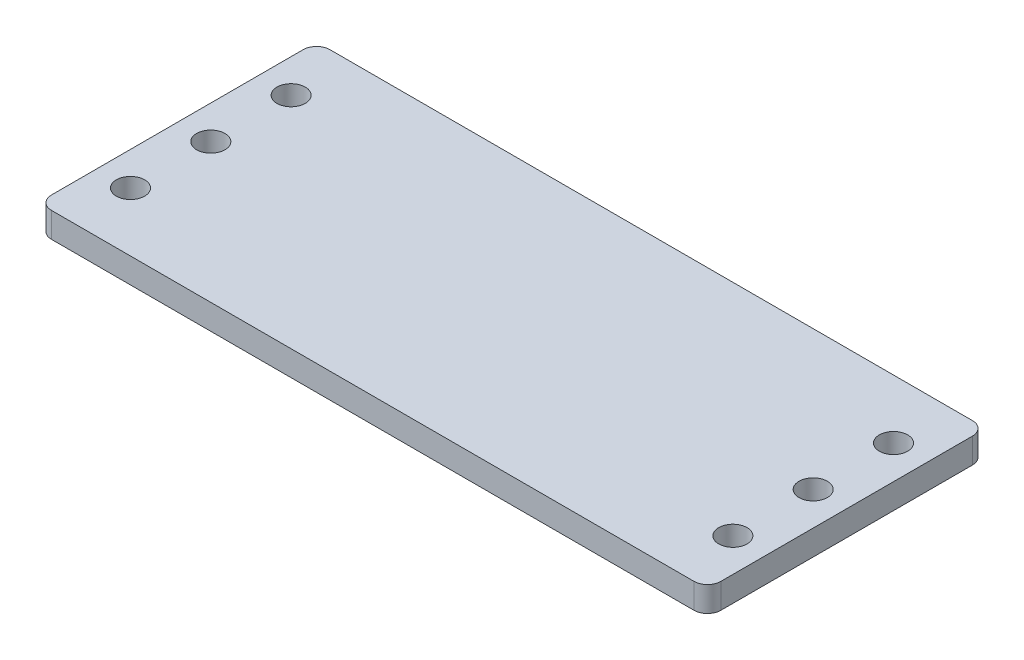
ISO-10303-21;
HEADER;
FILE_DESCRIPTION(('STEP AP214'),'2;1');
FILE_NAME('part.step','',(''),(''),'','','');
FILE_SCHEMA(('AUTOMOTIVE_DESIGN { 1 0 10303 214 1 1 1 1 }'));
ENDSEC;
DATA;
#1=APPLICATION_CONTEXT('core data for automotive mechanical design processes');
#2=APPLICATION_PROTOCOL_DEFINITION('international standard','automotive_design',2000,#1);
#3=PRODUCT_CONTEXT('',#1,'mechanical');
#4=PRODUCT('Part','Part','',(#3));
#5=PRODUCT_RELATED_PRODUCT_CATEGORY('part','',(#4));
#6=PRODUCT_DEFINITION_FORMATION('','',#4);
#7=PRODUCT_DEFINITION_CONTEXT('part definition',#1,'design');
#8=PRODUCT_DEFINITION('design','',#6,#7);
#9=PRODUCT_DEFINITION_SHAPE('','',#8);
#10=(LENGTH_UNIT() NAMED_UNIT(*) SI_UNIT(.MILLI.,.METRE.));
#11=(NAMED_UNIT(*) PLANE_ANGLE_UNIT() SI_UNIT($,.RADIAN.));
#12=(NAMED_UNIT(*) SI_UNIT($,.STERADIAN.) SOLID_ANGLE_UNIT());
#13=UNCERTAINTY_MEASURE_WITH_UNIT(LENGTH_MEASURE(1.E-05),#10,'distance_accuracy_value','');
#14=(GEOMETRIC_REPRESENTATION_CONTEXT(3) GLOBAL_UNCERTAINTY_ASSIGNED_CONTEXT((#13)) GLOBAL_UNIT_ASSIGNED_CONTEXT((#10,
#11,#12)) REPRESENTATION_CONTEXT('',''));
#15=CARTESIAN_POINT('',(0.,0.,0.));
#16=DIRECTION('',(0.,0.,1.));
#17=DIRECTION('',(1.,0.,0.));
#18=AXIS2_PLACEMENT_3D('',#15,#16,#17);
#19=CARTESIAN_POINT('',(63.5,4.7625,-26.416));
#20=DIRECTION('',(-1.,0.,0.));
#21=DIRECTION('',(0.,0.,1.));
#22=AXIS2_PLACEMENT_3D('',#19,#20,#21);
#23=PLANE('',#22);
#24=DIRECTION('',(0.,0.,-1.));
#25=VECTOR('',#24,1.);
#26=CARTESIAN_POINT('',(63.5,4.7625,-26.416));
#27=LINE('',#26,#25);
#28=CARTESIAN_POINT('',(63.5,4.7625,23.876));
#29=VERTEX_POINT('',#28);
#30=CARTESIAN_POINT('',(63.5,4.7625,-23.876));
#31=VERTEX_POINT('',#30);
#32=EDGE_CURVE('E119',#29,#31,#27,.T.);
#33=ORIENTED_EDGE('',*,*,#32,.F.);
#34=DIRECTION('',(0.,-1.,0.));
#35=VECTOR('',#34,1.);
#36=CARTESIAN_POINT('',(63.5,4.7625,23.876));
#37=LINE('',#36,#35);
#38=CARTESIAN_POINT('',(63.5,0.,23.876));
#39=VERTEX_POINT('',#38);
#40=EDGE_CURVE('E104',#29,#39,#37,.T.);
#41=ORIENTED_EDGE('',*,*,#40,.T.);
#42=DIRECTION('',(0.,0.,-1.));
#43=VECTOR('',#42,1.);
#44=CARTESIAN_POINT('',(63.5,0.,-26.416));
#45=LINE('',#44,#43);
#46=CARTESIAN_POINT('',(63.5,0.,-23.876));
#47=VERTEX_POINT('',#46);
#48=EDGE_CURVE('E116',#39,#47,#45,.T.);
#49=ORIENTED_EDGE('',*,*,#48,.T.);
#50=DIRECTION('',(0.,-1.,0.));
#51=VECTOR('',#50,1.);
#52=CARTESIAN_POINT('',(63.5,4.7625,-23.876));
#53=LINE('',#52,#51);
#54=EDGE_CURVE('E121',#47,#31,#53,.F.);
#55=ORIENTED_EDGE('',*,*,#54,.T.);
#56=EDGE_LOOP('',(#33,#41,#49,#55));
#57=FACE_BOUND('',#56,.T.);
#58=ADVANCED_FACE('F34',(#57),#23,.F.);
#59=CARTESIAN_POINT('',(-63.5,4.7625,-26.416));
#60=DIRECTION('',(0.,0.,1.));
#61=DIRECTION('',(1.,0.,0.));
#62=AXIS2_PLACEMENT_3D('',#59,#60,#61);
#63=PLANE('',#62);
#64=DIRECTION('',(-1.,0.,0.));
#65=VECTOR('',#64,1.);
#66=CARTESIAN_POINT('',(-63.5,4.7625,-26.416));
#67=LINE('',#66,#65);
#68=CARTESIAN_POINT('',(60.96,4.7625,-26.416));
#69=VERTEX_POINT('',#68);
#70=CARTESIAN_POINT('',(-60.96,4.7625,-26.416));
#71=VERTEX_POINT('',#70);
#72=EDGE_CURVE('E165',#69,#71,#67,.T.);
#73=ORIENTED_EDGE('',*,*,#72,.F.);
#74=DIRECTION('',(0.,-1.,0.));
#75=VECTOR('',#74,1.);
#76=CARTESIAN_POINT('',(60.96,4.7625,-26.416));
#77=LINE('',#76,#75);
#78=CARTESIAN_POINT('',(60.96,0.,-26.416));
#79=VERTEX_POINT('',#78);
#80=EDGE_CURVE('E158',#69,#79,#77,.T.);
#81=ORIENTED_EDGE('',*,*,#80,.T.);
#82=DIRECTION('',(-1.,0.,0.));
#83=VECTOR('',#82,1.);
#84=CARTESIAN_POINT('',(-63.5,0.,-26.416));
#85=LINE('',#84,#83);
#86=CARTESIAN_POINT('',(-60.96,0.,-26.416));
#87=VERTEX_POINT('',#86);
#88=EDGE_CURVE('E125',#79,#87,#85,.T.);
#89=ORIENTED_EDGE('',*,*,#88,.T.);
#90=DIRECTION('',(0.,-1.,0.));
#91=VECTOR('',#90,1.);
#92=CARTESIAN_POINT('',(-60.96,4.7625,-26.416));
#93=LINE('',#92,#91);
#94=EDGE_CURVE('E156',#87,#71,#93,.F.);
#95=ORIENTED_EDGE('',*,*,#94,.T.);
#96=EDGE_LOOP('',(#73,#81,#89,#95));
#97=FACE_BOUND('',#96,.T.);
#98=ADVANCED_FACE('F163',(#97),#63,.F.);
#99=CARTESIAN_POINT('',(-63.5,4.7625,-26.416));
#100=DIRECTION('',(1.,0.,0.));
#101=DIRECTION('',(0.,0.,-1.));
#102=AXIS2_PLACEMENT_3D('',#99,#100,#101);
#103=PLANE('',#102);
#104=DIRECTION('',(0.,0.,1.));
#105=VECTOR('',#104,1.);
#106=CARTESIAN_POINT('',(-63.5,4.7625,-26.416));
#107=LINE('',#106,#105);
#108=CARTESIAN_POINT('',(-63.5,4.7625,-23.876));
#109=VERTEX_POINT('',#108);
#110=CARTESIAN_POINT('',(-63.5,4.7625,23.876));
#111=VERTEX_POINT('',#110);
#112=EDGE_CURVE('E173',#109,#111,#107,.T.);
#113=ORIENTED_EDGE('',*,*,#112,.F.);
#114=DIRECTION('',(0.,-1.,0.));
#115=VECTOR('',#114,1.);
#116=CARTESIAN_POINT('',(-63.5,4.7625,-23.876));
#117=LINE('',#116,#115);
#118=CARTESIAN_POINT('',(-63.5,0.,-23.876));
#119=VERTEX_POINT('',#118);
#120=EDGE_CURVE('E12',#109,#119,#117,.T.);
#121=ORIENTED_EDGE('',*,*,#120,.T.);
#122=DIRECTION('',(0.,0.,1.));
#123=VECTOR('',#122,1.);
#124=CARTESIAN_POINT('',(-63.5,0.,-26.416));
#125=LINE('',#124,#123);
#126=CARTESIAN_POINT('',(-63.5,0.,23.876));
#127=VERTEX_POINT('',#126);
#128=EDGE_CURVE('E129',#119,#127,#125,.T.);
#129=ORIENTED_EDGE('',*,*,#128,.T.);
#130=DIRECTION('',(0.,-1.,0.));
#131=VECTOR('',#130,1.);
#132=CARTESIAN_POINT('',(-63.5,4.7625,23.876));
#133=LINE('',#132,#131);
#134=EDGE_CURVE('E42',#127,#111,#133,.F.);
#135=ORIENTED_EDGE('',*,*,#134,.T.);
#136=EDGE_LOOP('',(#113,#121,#129,#135));
#137=FACE_BOUND('',#136,.T.);
#138=ADVANCED_FACE('F172',(#137),#103,.F.);
#139=CARTESIAN_POINT('',(-63.5,4.7625,26.416));
#140=DIRECTION('',(0.,0.,-1.));
#141=DIRECTION('',(-1.,0.,0.));
#142=AXIS2_PLACEMENT_3D('',#139,#140,#141);
#143=PLANE('',#142);
#144=DIRECTION('',(1.,0.,0.));
#145=VECTOR('',#144,1.);
#146=CARTESIAN_POINT('',(-63.5,0.,26.416));
#147=LINE('',#146,#145);
#148=CARTESIAN_POINT('',(-60.96,0.,26.416));
#149=VERTEX_POINT('',#148);
#150=CARTESIAN_POINT('',(60.96,0.,26.416));
#151=VERTEX_POINT('',#150);
#152=EDGE_CURVE('E139',#149,#151,#147,.T.);
#153=ORIENTED_EDGE('',*,*,#152,.T.);
#154=DIRECTION('',(0.,-1.,0.));
#155=VECTOR('',#154,1.);
#156=CARTESIAN_POINT('',(60.96,4.7625,26.416));
#157=LINE('',#156,#155);
#158=CARTESIAN_POINT('',(60.96,4.7625,26.416));
#159=VERTEX_POINT('',#158);
#160=EDGE_CURVE('E105',#151,#159,#157,.F.);
#161=ORIENTED_EDGE('',*,*,#160,.T.);
#162=DIRECTION('',(1.,0.,0.));
#163=VECTOR('',#162,1.);
#164=CARTESIAN_POINT('',(-63.5,4.7625,26.416));
#165=LINE('',#164,#163);
#166=CARTESIAN_POINT('',(-60.96,4.7625,26.416));
#167=VERTEX_POINT('',#166);
#168=EDGE_CURVE('E135',#167,#159,#165,.T.);
#169=ORIENTED_EDGE('',*,*,#168,.F.);
#170=DIRECTION('',(0.,-1.,0.));
#171=VECTOR('',#170,1.);
#172=CARTESIAN_POINT('',(-60.96,4.7625,26.416));
#173=LINE('',#172,#171);
#174=EDGE_CURVE('E110',#167,#149,#173,.T.);
#175=ORIENTED_EDGE('',*,*,#174,.T.);
#176=EDGE_LOOP('',(#153,#161,#169,#175));
#177=FACE_BOUND('',#176,.T.);
#178=ADVANCED_FACE('F218',(#177),#143,.F.);
#179=CARTESIAN_POINT('',(0.,4.7625,0.));
#180=DIRECTION('',(0.,1.,0.));
#181=DIRECTION('',(0.,0.,1.));
#182=AXIS2_PLACEMENT_3D('',#179,#180,#181);
#183=PLANE('',#182);
#184=CARTESIAN_POINT('',(-57.1499999999987,4.7625,0.));
#185=DIRECTION('',(0.,1.,0.));
#186=DIRECTION('',(0.,0.,-1.));
#187=AXIS2_PLACEMENT_3D('',#184,#185,#186);
#188=CIRCLE('',#187,2.69);
#189=CARTESIAN_POINT('',(-57.1499999999987,4.7625,-2.69));
#190=VERTEX_POINT('',#189);
#191=EDGE_CURVE('E197',#190,#190,#188,.T.);
#192=ORIENTED_EDGE('',*,*,#191,.F.);
#193=EDGE_LOOP('',(#192));
#194=FACE_BOUND('',#193,.T.);
#195=CARTESIAN_POINT('',(-57.1499999999987,4.7625,15.24));
#196=DIRECTION('',(0.,1.,0.));
#197=DIRECTION('',(0.,0.,-1.));
#198=AXIS2_PLACEMENT_3D('',#195,#196,#197);
#199=CIRCLE('',#198,2.69);
#200=CARTESIAN_POINT('',(-57.1499999999987,4.7625,12.55));
#201=VERTEX_POINT('',#200);
#202=EDGE_CURVE('E203',#201,#201,#199,.T.);
#203=ORIENTED_EDGE('',*,*,#202,.F.);
#204=EDGE_LOOP('',(#203));
#205=FACE_BOUND('',#204,.T.);
#206=CARTESIAN_POINT('',(-57.1499999999987,4.7625,-15.24));
#207=DIRECTION('',(0.,1.,0.));
#208=DIRECTION('',(0.,0.,-1.));
#209=AXIS2_PLACEMENT_3D('',#206,#207,#208);
#210=CIRCLE('',#209,2.69);
#211=CARTESIAN_POINT('',(-57.1499999999987,4.7625,-17.93));
#212=VERTEX_POINT('',#211);
#213=EDGE_CURVE('E186',#212,#212,#210,.T.);
#214=ORIENTED_EDGE('',*,*,#213,.F.);
#215=EDGE_LOOP('',(#214));
#216=FACE_BOUND('',#215,.T.);
#217=CARTESIAN_POINT('',(57.1499999999987,4.7625,0.));
#218=DIRECTION('',(0.,-1.,0.));
#219=DIRECTION('',(0.,0.,-1.));
#220=AXIS2_PLACEMENT_3D('',#217,#218,#219);
#221=CIRCLE('',#220,2.69);
#222=CARTESIAN_POINT('',(57.1499999999987,4.7625,-2.69));
#223=VERTEX_POINT('',#222);
#224=EDGE_CURVE('E180',#223,#223,#221,.T.);
#225=ORIENTED_EDGE('',*,*,#224,.T.);
#226=EDGE_LOOP('',(#225));
#227=FACE_BOUND('',#226,.T.);
#228=CARTESIAN_POINT('',(57.1499999999987,4.7625,15.24));
#229=DIRECTION('',(0.,-1.,0.));
#230=DIRECTION('',(0.,0.,-1.));
#231=AXIS2_PLACEMENT_3D('',#228,#229,#230);
#232=CIRCLE('',#231,2.69);
#233=CARTESIAN_POINT('',(57.1499999999987,4.7625,12.55));
#234=VERTEX_POINT('',#233);
#235=EDGE_CURVE('E185',#234,#234,#232,.T.);
#236=ORIENTED_EDGE('',*,*,#235,.T.);
#237=EDGE_LOOP('',(#236));
#238=FACE_BOUND('',#237,.T.);
#239=CARTESIAN_POINT('',(57.1499999999987,4.7625,-15.24));
#240=DIRECTION('',(0.,-1.,0.));
#241=DIRECTION('',(0.,0.,-1.));
#242=AXIS2_PLACEMENT_3D('',#239,#240,#241);
#243=CIRCLE('',#242,2.69);
#244=CARTESIAN_POINT('',(57.1499999999987,4.7625,-17.93));
#245=VERTEX_POINT('',#244);
#246=EDGE_CURVE('E126',#245,#245,#243,.T.);
#247=ORIENTED_EDGE('',*,*,#246,.T.);
#248=EDGE_LOOP('',(#247));
#249=FACE_BOUND('',#248,.T.);
#250=ORIENTED_EDGE('',*,*,#168,.T.);
#251=CARTESIAN_POINT('',(60.96,4.7625,23.876));
#252=DIRECTION('',(0.,1.,0.));
#253=DIRECTION('',(0.,0.,1.));
#254=AXIS2_PLACEMENT_3D('',#251,#252,#253);
#255=CIRCLE('',#254,2.54);
#256=EDGE_CURVE('E154',#159,#29,#255,.T.);
#257=ORIENTED_EDGE('',*,*,#256,.T.);
#258=ORIENTED_EDGE('',*,*,#32,.T.);
#259=CARTESIAN_POINT('',(60.96,4.7625,-23.876));
#260=DIRECTION('',(0.,1.,0.));
#261=DIRECTION('',(0.,0.,1.));
#262=AXIS2_PLACEMENT_3D('',#259,#260,#261);
#263=CIRCLE('',#262,2.54);
#264=EDGE_CURVE('E152',#31,#69,#263,.T.);
#265=ORIENTED_EDGE('',*,*,#264,.T.);
#266=ORIENTED_EDGE('',*,*,#72,.T.);
#267=CARTESIAN_POINT('',(-60.96,4.7625,-23.876));
#268=DIRECTION('',(0.,1.,0.));
#269=DIRECTION('',(0.,0.,1.));
#270=AXIS2_PLACEMENT_3D('',#267,#268,#269);
#271=CIRCLE('',#270,2.54);
#272=EDGE_CURVE('E55',#71,#109,#271,.T.);
#273=ORIENTED_EDGE('',*,*,#272,.T.);
#274=ORIENTED_EDGE('',*,*,#112,.T.);
#275=CARTESIAN_POINT('',(-60.96,4.7625,23.876));
#276=DIRECTION('',(0.,1.,0.));
#277=DIRECTION('',(0.,0.,1.));
#278=AXIS2_PLACEMENT_3D('',#275,#276,#277);
#279=CIRCLE('',#278,2.54);
#280=EDGE_CURVE('E149',#111,#167,#279,.T.);
#281=ORIENTED_EDGE('',*,*,#280,.T.);
#282=EDGE_LOOP('',(#250,#257,#258,#265,#266,#273,#274,#281));
#283=FACE_BOUND('',#282,.T.);
#284=ADVANCED_FACE('F215',(#194,#205,#216,#227,#238,#249,#283),#183,.T.);
#285=CARTESIAN_POINT('',(0.,0.,0.));
#286=DIRECTION('',(0.,1.,0.));
#287=DIRECTION('',(0.,0.,1.));
#288=AXIS2_PLACEMENT_3D('',#285,#286,#287);
#289=PLANE('',#288);
#290=CARTESIAN_POINT('',(-57.1499999999987,0.,0.));
#291=DIRECTION('',(0.,1.,0.));
#292=DIRECTION('',(0.,0.,-1.));
#293=AXIS2_PLACEMENT_3D('',#290,#291,#292);
#294=CIRCLE('',#293,2.69);
#295=CARTESIAN_POINT('',(-57.1499999999987,0.,-2.69));
#296=VERTEX_POINT('',#295);
#297=EDGE_CURVE('E206',#296,#296,#294,.T.);
#298=ORIENTED_EDGE('',*,*,#297,.T.);
#299=EDGE_LOOP('',(#298));
#300=FACE_BOUND('',#299,.T.);
#301=CARTESIAN_POINT('',(-57.1499999999987,0.,15.24));
#302=DIRECTION('',(0.,1.,0.));
#303=DIRECTION('',(0.,0.,-1.));
#304=AXIS2_PLACEMENT_3D('',#301,#302,#303);
#305=CIRCLE('',#304,2.69);
#306=CARTESIAN_POINT('',(-57.1499999999987,0.,12.55));
#307=VERTEX_POINT('',#306);
#308=EDGE_CURVE('E200',#307,#307,#305,.T.);
#309=ORIENTED_EDGE('',*,*,#308,.T.);
#310=EDGE_LOOP('',(#309));
#311=FACE_BOUND('',#310,.T.);
#312=CARTESIAN_POINT('',(-57.1499999999987,0.,-15.24));
#313=DIRECTION('',(0.,1.,0.));
#314=DIRECTION('',(0.,0.,-1.));
#315=AXIS2_PLACEMENT_3D('',#312,#313,#314);
#316=CIRCLE('',#315,2.69);
#317=CARTESIAN_POINT('',(-57.1499999999987,0.,-17.93));
#318=VERTEX_POINT('',#317);
#319=EDGE_CURVE('E194',#318,#318,#316,.T.);
#320=ORIENTED_EDGE('',*,*,#319,.T.);
#321=EDGE_LOOP('',(#320));
#322=FACE_BOUND('',#321,.T.);
#323=CARTESIAN_POINT('',(57.1499999999987,0.,0.));
#324=DIRECTION('',(0.,-1.,0.));
#325=DIRECTION('',(0.,0.,-1.));
#326=AXIS2_PLACEMENT_3D('',#323,#324,#325);
#327=CIRCLE('',#326,2.69);
#328=CARTESIAN_POINT('',(57.1499999999987,0.,-2.69));
#329=VERTEX_POINT('',#328);
#330=EDGE_CURVE('E189',#329,#329,#327,.T.);
#331=ORIENTED_EDGE('',*,*,#330,.F.);
#332=EDGE_LOOP('',(#331));
#333=FACE_BOUND('',#332,.T.);
#334=CARTESIAN_POINT('',(57.1499999999987,0.,15.24));
#335=DIRECTION('',(0.,-1.,0.));
#336=DIRECTION('',(0.,0.,-1.));
#337=AXIS2_PLACEMENT_3D('',#334,#335,#336);
#338=CIRCLE('',#337,2.69);
#339=CARTESIAN_POINT('',(57.1499999999987,0.,12.55));
#340=VERTEX_POINT('',#339);
#341=EDGE_CURVE('E182',#340,#340,#338,.T.);
#342=ORIENTED_EDGE('',*,*,#341,.F.);
#343=EDGE_LOOP('',(#342));
#344=FACE_BOUND('',#343,.T.);
#345=CARTESIAN_POINT('',(57.1499999999987,0.,-15.24));
#346=DIRECTION('',(0.,-1.,0.));
#347=DIRECTION('',(0.,0.,-1.));
#348=AXIS2_PLACEMENT_3D('',#345,#346,#347);
#349=CIRCLE('',#348,2.69);
#350=CARTESIAN_POINT('',(57.1499999999987,0.,-17.93));
#351=VERTEX_POINT('',#350);
#352=EDGE_CURVE('E132',#351,#351,#349,.T.);
#353=ORIENTED_EDGE('',*,*,#352,.F.);
#354=EDGE_LOOP('',(#353));
#355=FACE_BOUND('',#354,.T.);
#356=ORIENTED_EDGE('',*,*,#48,.F.);
#357=CARTESIAN_POINT('',(60.96,0.,23.876));
#358=DIRECTION('',(0.,1.,0.));
#359=DIRECTION('',(0.,0.,1.));
#360=AXIS2_PLACEMENT_3D('',#357,#358,#359);
#361=CIRCLE('',#360,2.54);
#362=EDGE_CURVE('E100',#39,#151,#361,.F.);
#363=ORIENTED_EDGE('',*,*,#362,.T.);
#364=ORIENTED_EDGE('',*,*,#152,.F.);
#365=CARTESIAN_POINT('',(-60.96,0.,23.876));
#366=DIRECTION('',(0.,1.,0.));
#367=DIRECTION('',(0.,0.,1.));
#368=AXIS2_PLACEMENT_3D('',#365,#366,#367);
#369=CIRCLE('',#368,2.54);
#370=EDGE_CURVE('E120',#149,#127,#369,.F.);
#371=ORIENTED_EDGE('',*,*,#370,.T.);
#372=ORIENTED_EDGE('',*,*,#128,.F.);
#373=CARTESIAN_POINT('',(-60.96,0.,-23.876));
#374=DIRECTION('',(0.,1.,0.));
#375=DIRECTION('',(0.,0.,1.));
#376=AXIS2_PLACEMENT_3D('',#373,#374,#375);
#377=CIRCLE('',#376,2.54);
#378=EDGE_CURVE('E143',#119,#87,#377,.F.);
#379=ORIENTED_EDGE('',*,*,#378,.T.);
#380=ORIENTED_EDGE('',*,*,#88,.F.);
#381=CARTESIAN_POINT('',(60.96,0.,-23.876));
#382=DIRECTION('',(0.,1.,0.));
#383=DIRECTION('',(0.,0.,1.));
#384=AXIS2_PLACEMENT_3D('',#381,#382,#383);
#385=CIRCLE('',#384,2.54);
#386=EDGE_CURVE('E111',#79,#47,#385,.F.);
#387=ORIENTED_EDGE('',*,*,#386,.T.);
#388=EDGE_LOOP('',(#356,#363,#364,#371,#372,#379,#380,#387));
#389=FACE_BOUND('',#388,.T.);
#390=ADVANCED_FACE('F123',(#300,#311,#322,#333,#344,#355,#389),#289,.F.);
#391=CARTESIAN_POINT('',(60.96,4.7625,23.876));
#392=DIRECTION('',(0.,-1.,0.));
#393=DIRECTION('',(0.,0.,-1.));
#394=AXIS2_PLACEMENT_3D('',#391,#392,#393);
#395=CYLINDRICAL_SURFACE('',#394,2.54);
#396=ORIENTED_EDGE('',*,*,#256,.F.);
#397=ORIENTED_EDGE('',*,*,#160,.F.);
#398=ORIENTED_EDGE('',*,*,#362,.F.);
#399=ORIENTED_EDGE('',*,*,#40,.F.);
#400=EDGE_LOOP('',(#396,#397,#398,#399));
#401=FACE_BOUND('',#400,.T.);
#402=ADVANCED_FACE('F103',(#401),#395,.T.);
#403=CARTESIAN_POINT('',(60.96,4.7625,-23.876));
#404=DIRECTION('',(0.,-1.,0.));
#405=DIRECTION('',(0.,0.,-1.));
#406=AXIS2_PLACEMENT_3D('',#403,#404,#405);
#407=CYLINDRICAL_SURFACE('',#406,2.54);
#408=ORIENTED_EDGE('',*,*,#264,.F.);
#409=ORIENTED_EDGE('',*,*,#54,.F.);
#410=ORIENTED_EDGE('',*,*,#386,.F.);
#411=ORIENTED_EDGE('',*,*,#80,.F.);
#412=EDGE_LOOP('',(#408,#409,#410,#411));
#413=FACE_BOUND('',#412,.T.);
#414=ADVANCED_FACE('F242',(#413),#407,.T.);
#415=CARTESIAN_POINT('',(-60.96,4.7625,-23.876));
#416=DIRECTION('',(0.,-1.,0.));
#417=DIRECTION('',(0.,0.,-1.));
#418=AXIS2_PLACEMENT_3D('',#415,#416,#417);
#419=CYLINDRICAL_SURFACE('',#418,2.54);
#420=ORIENTED_EDGE('',*,*,#272,.F.);
#421=ORIENTED_EDGE('',*,*,#94,.F.);
#422=ORIENTED_EDGE('',*,*,#378,.F.);
#423=ORIENTED_EDGE('',*,*,#120,.F.);
#424=EDGE_LOOP('',(#420,#421,#422,#423));
#425=FACE_BOUND('',#424,.T.);
#426=ADVANCED_FACE('F171',(#425),#419,.T.);
#427=CARTESIAN_POINT('',(-60.96,4.7625,23.876));
#428=DIRECTION('',(0.,-1.,0.));
#429=DIRECTION('',(0.,0.,-1.));
#430=AXIS2_PLACEMENT_3D('',#427,#428,#429);
#431=CYLINDRICAL_SURFACE('',#430,2.54);
#432=ORIENTED_EDGE('',*,*,#280,.F.);
#433=ORIENTED_EDGE('',*,*,#134,.F.);
#434=ORIENTED_EDGE('',*,*,#370,.F.);
#435=ORIENTED_EDGE('',*,*,#174,.F.);
#436=EDGE_LOOP('',(#432,#433,#434,#435));
#437=FACE_BOUND('',#436,.T.);
#438=ADVANCED_FACE('F36',(#437),#431,.T.);
#439=CARTESIAN_POINT('',(57.1499999999987,4.7625,-15.24));
#440=DIRECTION('',(0.,-1.,0.));
#441=DIRECTION('',(0.,0.,-1.));
#442=AXIS2_PLACEMENT_3D('',#439,#440,#441);
#443=CYLINDRICAL_SURFACE('',#442,2.69);
#444=CARTESIAN_POINT('',(57.1499999999987,4.7625,-17.93));
#445=CARTESIAN_POINT('',(57.1499999999987,4.712890625,-17.93));
#446=CARTESIAN_POINT('',(57.1499999999987,4.66328125,-17.93));
#447=CARTESIAN_POINT('',(57.1499999999987,4.5640625,-17.93));
#448=CARTESIAN_POINT('',(57.1499999999987,4.514453125,-17.93));
#449=CARTESIAN_POINT('',(57.1499999999987,4.415234375,-17.93));
#450=CARTESIAN_POINT('',(57.1499999999987,4.365625,-17.93));
#451=CARTESIAN_POINT('',(57.1499999999987,4.26640625,-17.93));
#452=CARTESIAN_POINT('',(57.1499999999987,4.216796875,-17.93));
#453=CARTESIAN_POINT('',(57.1499999999987,4.117578125,-17.93));
#454=CARTESIAN_POINT('',(57.1499999999987,4.06796875,-17.93));
#455=CARTESIAN_POINT('',(57.1499999999987,3.96875,-17.93));
#456=CARTESIAN_POINT('',(57.1499999999987,3.919140625,-17.93));
#457=CARTESIAN_POINT('',(57.1499999999987,3.819921875,-17.93));
#458=CARTESIAN_POINT('',(57.1499999999987,3.7703125,-17.93));
#459=CARTESIAN_POINT('',(57.1499999999987,3.67109375,-17.93));
#460=CARTESIAN_POINT('',(57.1499999999987,3.621484375,-17.93));
#461=CARTESIAN_POINT('',(57.1499999999987,3.522265625,-17.93));
#462=CARTESIAN_POINT('',(57.1499999999987,3.47265625,-17.93));
#463=CARTESIAN_POINT('',(57.1499999999987,3.3734375,-17.93));
#464=CARTESIAN_POINT('',(57.1499999999987,3.323828125,-17.93));
#465=CARTESIAN_POINT('',(57.1499999999987,3.224609375,-17.93));
#466=CARTESIAN_POINT('',(57.1499999999987,3.175,-17.93));
#467=CARTESIAN_POINT('',(57.1499999999987,3.07578125,-17.93));
#468=CARTESIAN_POINT('',(57.1499999999987,3.026171875,-17.93));
#469=CARTESIAN_POINT('',(57.1499999999987,2.926953125,-17.93));
#470=CARTESIAN_POINT('',(57.1499999999987,2.87734375,-17.93));
#471=CARTESIAN_POINT('',(57.1499999999987,2.778125,-17.93));
#472=CARTESIAN_POINT('',(57.1499999999987,2.728515625,-17.93));
#473=CARTESIAN_POINT('',(57.1499999999987,2.629296875,-17.93));
#474=CARTESIAN_POINT('',(57.1499999999987,2.5796875,-17.93));
#475=CARTESIAN_POINT('',(57.1499999999987,2.48046875,-17.93));
#476=CARTESIAN_POINT('',(57.1499999999987,2.430859375,-17.93));
#477=CARTESIAN_POINT('',(57.1499999999987,2.331640625,-17.93));
#478=CARTESIAN_POINT('',(57.1499999999987,2.28203125,-17.93));
#479=CARTESIAN_POINT('',(57.1499999999987,2.1828125,-17.93));
#480=CARTESIAN_POINT('',(57.1499999999987,2.133203125,-17.93));
#481=CARTESIAN_POINT('',(57.1499999999987,2.033984375,-17.93));
#482=CARTESIAN_POINT('',(57.1499999999987,1.984375,-17.93));
#483=CARTESIAN_POINT('',(57.1499999999987,1.88515625,-17.93));
#484=CARTESIAN_POINT('',(57.1499999999987,1.835546875,-17.93));
#485=CARTESIAN_POINT('',(57.1499999999987,1.736328125,-17.93));
#486=CARTESIAN_POINT('',(57.1499999999987,1.68671875,-17.93));
#487=CARTESIAN_POINT('',(57.1499999999987,1.5875,-17.93));
#488=CARTESIAN_POINT('',(57.1499999999987,1.537890625,-17.93));
#489=CARTESIAN_POINT('',(57.1499999999987,1.438671875,-17.93));
#490=CARTESIAN_POINT('',(57.1499999999987,1.3890625,-17.93));
#491=CARTESIAN_POINT('',(57.1499999999987,1.28984375,-17.93));
#492=CARTESIAN_POINT('',(57.1499999999987,1.240234375,-17.93));
#493=CARTESIAN_POINT('',(57.1499999999987,1.141015625,-17.93));
#494=CARTESIAN_POINT('',(57.1499999999987,1.09140625,-17.93));
#495=CARTESIAN_POINT('',(57.1499999999987,0.9921875,-17.93));
#496=CARTESIAN_POINT('',(57.1499999999987,0.942578125,-17.93));
#497=CARTESIAN_POINT('',(57.1499999999987,0.843359375,-17.93));
#498=CARTESIAN_POINT('',(57.1499999999987,0.79375,-17.93));
#499=CARTESIAN_POINT('',(57.1499999999987,0.69453125,-17.93));
#500=CARTESIAN_POINT('',(57.1499999999987,0.644921875,-17.93));
#501=CARTESIAN_POINT('',(57.1499999999987,0.545703125,-17.93));
#502=CARTESIAN_POINT('',(57.1499999999987,0.49609375,-17.93));
#503=CARTESIAN_POINT('',(57.1499999999987,0.396875,-17.93));
#504=CARTESIAN_POINT('',(57.1499999999987,0.347265625,-17.93));
#505=CARTESIAN_POINT('',(57.1499999999987,0.248046875,-17.93));
#506=CARTESIAN_POINT('',(57.1499999999987,0.1984375,-17.93));
#507=CARTESIAN_POINT('',(57.1499999999987,0.09921875,-17.93));
#508=CARTESIAN_POINT('',(57.1499999999987,0.049609375,-17.93));
#509=CARTESIAN_POINT('',(57.1499999999987,0.,-17.93));
#510=B_SPLINE_CURVE_WITH_KNOTS('',3,(#444,#445,#446,#447,#448,#449,#450,#451,#452,#453,#454,
#455,#456,#457,#458,#459,#460,#461,#462,#463,#464,#465,#466,#467,#468,#469,#470,#471,#472,#473,
#474,#475,#476,#477,#478,#479,#480,#481,#482,#483,#484,#485,#486,#487,#488,#489,#490,#491,#492,
#493,#494,#495,#496,#497,#498,#499,#500,#501,#502,#503,#504,#505,#506,#507,#508,#509),
.UNSPECIFIED.,.F.,.F.,(4,2,2,2,2,2,2,2,2,2,2,2,2,2,2,2,2,2,2,2,2,2,2,2,2,2,2,2,2,2,2,2,4),(0.,
0.148828125,0.29765625,0.446484375,0.5953125,0.744140625,0.892968750000001,1.041796875,1.190625,
1.339453125,1.48828125,1.637109375,1.7859375,1.934765625,2.08359375,2.232421875,2.38125,
2.530078125,2.67890625,2.827734375,2.9765625,3.125390625,3.27421875,3.423046875,3.571875,
3.720703125,3.86953125,4.018359375,4.1671875,4.316015625,4.46484375,4.613671875,4.7625),.UNSPECIFIED.);
#511=EDGE_CURVE('BSEAM234',#245,#351,#510,.T.);
#512=ORIENTED_EDGE('',*,*,#246,.F.);
#513=ORIENTED_EDGE('',*,*,#352,.T.);
#514=ORIENTED_EDGE('',*,*,#511,.T.);
#515=ORIENTED_EDGE('',*,*,#511,.F.);
#516=EDGE_LOOP('',(#512,#514,#513,#515));
#517=FACE_BOUND('',#516,.T.);
#518=ADVANCED_FACE('F234',(#517),#443,.F.);
#519=CARTESIAN_POINT('',(57.1499999999987,4.7625,15.24));
#520=DIRECTION('',(0.,-1.,0.));
#521=DIRECTION('',(0.,0.,-1.));
#522=AXIS2_PLACEMENT_3D('',#519,#520,#521);
#523=CYLINDRICAL_SURFACE('',#522,2.69);
#524=CARTESIAN_POINT('',(57.1499999999987,4.7625,12.55));
#525=CARTESIAN_POINT('',(57.1499999999987,4.712890625,12.55));
#526=CARTESIAN_POINT('',(57.1499999999987,4.66328125,12.55));
#527=CARTESIAN_POINT('',(57.1499999999987,4.5640625,12.55));
#528=CARTESIAN_POINT('',(57.1499999999987,4.514453125,12.55));
#529=CARTESIAN_POINT('',(57.1499999999987,4.415234375,12.55));
#530=CARTESIAN_POINT('',(57.1499999999987,4.365625,12.55));
#531=CARTESIAN_POINT('',(57.1499999999987,4.26640625,12.55));
#532=CARTESIAN_POINT('',(57.1499999999987,4.216796875,12.55));
#533=CARTESIAN_POINT('',(57.1499999999987,4.117578125,12.55));
#534=CARTESIAN_POINT('',(57.1499999999987,4.06796875,12.55));
#535=CARTESIAN_POINT('',(57.1499999999987,3.96875,12.55));
#536=CARTESIAN_POINT('',(57.1499999999987,3.919140625,12.55));
#537=CARTESIAN_POINT('',(57.1499999999987,3.819921875,12.55));
#538=CARTESIAN_POINT('',(57.1499999999987,3.7703125,12.55));
#539=CARTESIAN_POINT('',(57.1499999999987,3.67109375,12.55));
#540=CARTESIAN_POINT('',(57.1499999999987,3.621484375,12.55));
#541=CARTESIAN_POINT('',(57.1499999999987,3.522265625,12.55));
#542=CARTESIAN_POINT('',(57.1499999999987,3.47265625,12.55));
#543=CARTESIAN_POINT('',(57.1499999999987,3.3734375,12.55));
#544=CARTESIAN_POINT('',(57.1499999999987,3.323828125,12.55));
#545=CARTESIAN_POINT('',(57.1499999999987,3.224609375,12.55));
#546=CARTESIAN_POINT('',(57.1499999999987,3.175,12.55));
#547=CARTESIAN_POINT('',(57.1499999999987,3.07578125,12.55));
#548=CARTESIAN_POINT('',(57.1499999999987,3.026171875,12.55));
#549=CARTESIAN_POINT('',(57.1499999999987,2.926953125,12.55));
#550=CARTESIAN_POINT('',(57.1499999999987,2.87734375,12.55));
#551=CARTESIAN_POINT('',(57.1499999999987,2.778125,12.55));
#552=CARTESIAN_POINT('',(57.1499999999987,2.728515625,12.55));
#553=CARTESIAN_POINT('',(57.1499999999987,2.629296875,12.55));
#554=CARTESIAN_POINT('',(57.1499999999987,2.5796875,12.55));
#555=CARTESIAN_POINT('',(57.1499999999987,2.48046875,12.55));
#556=CARTESIAN_POINT('',(57.1499999999987,2.430859375,12.55));
#557=CARTESIAN_POINT('',(57.1499999999987,2.331640625,12.55));
#558=CARTESIAN_POINT('',(57.1499999999987,2.28203125,12.55));
#559=CARTESIAN_POINT('',(57.1499999999987,2.1828125,12.55));
#560=CARTESIAN_POINT('',(57.1499999999987,2.133203125,12.55));
#561=CARTESIAN_POINT('',(57.1499999999987,2.033984375,12.55));
#562=CARTESIAN_POINT('',(57.1499999999987,1.984375,12.55));
#563=CARTESIAN_POINT('',(57.1499999999987,1.88515625,12.55));
#564=CARTESIAN_POINT('',(57.1499999999987,1.835546875,12.55));
#565=CARTESIAN_POINT('',(57.1499999999987,1.736328125,12.55));
#566=CARTESIAN_POINT('',(57.1499999999987,1.68671875,12.55));
#567=CARTESIAN_POINT('',(57.1499999999987,1.5875,12.55));
#568=CARTESIAN_POINT('',(57.1499999999987,1.537890625,12.55));
#569=CARTESIAN_POINT('',(57.1499999999987,1.438671875,12.55));
#570=CARTESIAN_POINT('',(57.1499999999987,1.3890625,12.55));
#571=CARTESIAN_POINT('',(57.1499999999987,1.28984375,12.55));
#572=CARTESIAN_POINT('',(57.1499999999987,1.240234375,12.55));
#573=CARTESIAN_POINT('',(57.1499999999987,1.141015625,12.55));
#574=CARTESIAN_POINT('',(57.1499999999987,1.09140625,12.55));
#575=CARTESIAN_POINT('',(57.1499999999987,0.9921875,12.55));
#576=CARTESIAN_POINT('',(57.1499999999987,0.942578125,12.55));
#577=CARTESIAN_POINT('',(57.1499999999987,0.843359375,12.55));
#578=CARTESIAN_POINT('',(57.1499999999987,0.79375,12.55));
#579=CARTESIAN_POINT('',(57.1499999999987,0.69453125,12.55));
#580=CARTESIAN_POINT('',(57.1499999999987,0.644921875,12.55));
#581=CARTESIAN_POINT('',(57.1499999999987,0.545703125,12.55));
#582=CARTESIAN_POINT('',(57.1499999999987,0.49609375,12.55));
#583=CARTESIAN_POINT('',(57.1499999999987,0.396875,12.55));
#584=CARTESIAN_POINT('',(57.1499999999987,0.347265625,12.55));
#585=CARTESIAN_POINT('',(57.1499999999987,0.248046875,12.55));
#586=CARTESIAN_POINT('',(57.1499999999987,0.1984375,12.55));
#587=CARTESIAN_POINT('',(57.1499999999987,0.09921875,12.55));
#588=CARTESIAN_POINT('',(57.1499999999987,0.049609375,12.55));
#589=CARTESIAN_POINT('',(57.1499999999987,0.,12.55));
#590=B_SPLINE_CURVE_WITH_KNOTS('',3,(#524,#525,#526,#527,#528,#529,#530,#531,#532,#533,#534,
#535,#536,#537,#538,#539,#540,#541,#542,#543,#544,#545,#546,#547,#548,#549,#550,#551,#552,#553,
#554,#555,#556,#557,#558,#559,#560,#561,#562,#563,#564,#565,#566,#567,#568,#569,#570,#571,#572,
#573,#574,#575,#576,#577,#578,#579,#580,#581,#582,#583,#584,#585,#586,#587,#588,#589),
.UNSPECIFIED.,.F.,.F.,(4,2,2,2,2,2,2,2,2,2,2,2,2,2,2,2,2,2,2,2,2,2,2,2,2,2,2,2,2,2,2,2,4),(0.,
0.148828125,0.29765625,0.446484375,0.5953125,0.744140625,0.892968750000001,1.041796875,1.190625,
1.339453125,1.48828125,1.637109375,1.7859375,1.934765625,2.08359375,2.232421875,2.38125,
2.530078125,2.67890625,2.827734375,2.9765625,3.125390625,3.27421875,3.423046875,3.571875,
3.720703125,3.86953125,4.018359375,4.1671875,4.316015625,4.46484375,4.613671875,4.7625),.UNSPECIFIED.);
#591=EDGE_CURVE('BSEAM239',#234,#340,#590,.T.);
#592=ORIENTED_EDGE('',*,*,#235,.F.);
#593=ORIENTED_EDGE('',*,*,#341,.T.);
#594=ORIENTED_EDGE('',*,*,#591,.T.);
#595=ORIENTED_EDGE('',*,*,#591,.F.);
#596=EDGE_LOOP('',(#592,#594,#593,#595));
#597=FACE_BOUND('',#596,.T.);
#598=ADVANCED_FACE('F239',(#597),#523,.F.);
#599=CARTESIAN_POINT('',(57.1499999999987,4.7625,0.));
#600=DIRECTION('',(0.,-1.,0.));
#601=DIRECTION('',(0.,0.,-1.));
#602=AXIS2_PLACEMENT_3D('',#599,#600,#601);
#603=CYLINDRICAL_SURFACE('',#602,2.69);
#604=CARTESIAN_POINT('',(57.1499999999987,4.7625,-2.69));
#605=CARTESIAN_POINT('',(57.1499999999987,4.712890625,-2.69));
#606=CARTESIAN_POINT('',(57.1499999999987,4.66328125,-2.69));
#607=CARTESIAN_POINT('',(57.1499999999987,4.5640625,-2.69));
#608=CARTESIAN_POINT('',(57.1499999999987,4.514453125,-2.69));
#609=CARTESIAN_POINT('',(57.1499999999987,4.415234375,-2.69));
#610=CARTESIAN_POINT('',(57.1499999999987,4.365625,-2.69));
#611=CARTESIAN_POINT('',(57.1499999999987,4.26640625,-2.69));
#612=CARTESIAN_POINT('',(57.1499999999987,4.216796875,-2.69));
#613=CARTESIAN_POINT('',(57.1499999999987,4.117578125,-2.69));
#614=CARTESIAN_POINT('',(57.1499999999987,4.06796875,-2.69));
#615=CARTESIAN_POINT('',(57.1499999999987,3.96875,-2.69));
#616=CARTESIAN_POINT('',(57.1499999999987,3.919140625,-2.69));
#617=CARTESIAN_POINT('',(57.1499999999987,3.819921875,-2.69));
#618=CARTESIAN_POINT('',(57.1499999999987,3.7703125,-2.69));
#619=CARTESIAN_POINT('',(57.1499999999987,3.67109375,-2.69));
#620=CARTESIAN_POINT('',(57.1499999999987,3.621484375,-2.69));
#621=CARTESIAN_POINT('',(57.1499999999987,3.522265625,-2.69));
#622=CARTESIAN_POINT('',(57.1499999999987,3.47265625,-2.69));
#623=CARTESIAN_POINT('',(57.1499999999987,3.3734375,-2.69));
#624=CARTESIAN_POINT('',(57.1499999999987,3.323828125,-2.69));
#625=CARTESIAN_POINT('',(57.1499999999987,3.224609375,-2.69));
#626=CARTESIAN_POINT('',(57.1499999999987,3.175,-2.69));
#627=CARTESIAN_POINT('',(57.1499999999987,3.07578125,-2.69));
#628=CARTESIAN_POINT('',(57.1499999999987,3.026171875,-2.69));
#629=CARTESIAN_POINT('',(57.1499999999987,2.926953125,-2.69));
#630=CARTESIAN_POINT('',(57.1499999999987,2.87734375,-2.69));
#631=CARTESIAN_POINT('',(57.1499999999987,2.778125,-2.69));
#632=CARTESIAN_POINT('',(57.1499999999987,2.728515625,-2.69));
#633=CARTESIAN_POINT('',(57.1499999999987,2.629296875,-2.69));
#634=CARTESIAN_POINT('',(57.1499999999987,2.5796875,-2.69));
#635=CARTESIAN_POINT('',(57.1499999999987,2.48046875,-2.69));
#636=CARTESIAN_POINT('',(57.1499999999987,2.430859375,-2.69));
#637=CARTESIAN_POINT('',(57.1499999999987,2.331640625,-2.69));
#638=CARTESIAN_POINT('',(57.1499999999987,2.28203125,-2.69));
#639=CARTESIAN_POINT('',(57.1499999999987,2.1828125,-2.69));
#640=CARTESIAN_POINT('',(57.1499999999987,2.133203125,-2.69));
#641=CARTESIAN_POINT('',(57.1499999999987,2.033984375,-2.69));
#642=CARTESIAN_POINT('',(57.1499999999987,1.984375,-2.69));
#643=CARTESIAN_POINT('',(57.1499999999987,1.88515625,-2.69));
#644=CARTESIAN_POINT('',(57.1499999999987,1.835546875,-2.69));
#645=CARTESIAN_POINT('',(57.1499999999987,1.736328125,-2.69));
#646=CARTESIAN_POINT('',(57.1499999999987,1.68671875,-2.69));
#647=CARTESIAN_POINT('',(57.1499999999987,1.5875,-2.69));
#648=CARTESIAN_POINT('',(57.1499999999987,1.537890625,-2.69));
#649=CARTESIAN_POINT('',(57.1499999999987,1.438671875,-2.69));
#650=CARTESIAN_POINT('',(57.1499999999987,1.3890625,-2.69));
#651=CARTESIAN_POINT('',(57.1499999999987,1.28984375,-2.69));
#652=CARTESIAN_POINT('',(57.1499999999987,1.240234375,-2.69));
#653=CARTESIAN_POINT('',(57.1499999999987,1.141015625,-2.69));
#654=CARTESIAN_POINT('',(57.1499999999987,1.09140625,-2.69));
#655=CARTESIAN_POINT('',(57.1499999999987,0.9921875,-2.69));
#656=CARTESIAN_POINT('',(57.1499999999987,0.942578125,-2.69));
#657=CARTESIAN_POINT('',(57.1499999999987,0.843359375,-2.69));
#658=CARTESIAN_POINT('',(57.1499999999987,0.79375,-2.69));
#659=CARTESIAN_POINT('',(57.1499999999987,0.69453125,-2.69));
#660=CARTESIAN_POINT('',(57.1499999999987,0.644921875,-2.69));
#661=CARTESIAN_POINT('',(57.1499999999987,0.545703125,-2.69));
#662=CARTESIAN_POINT('',(57.1499999999987,0.49609375,-2.69));
#663=CARTESIAN_POINT('',(57.1499999999987,0.396875,-2.69));
#664=CARTESIAN_POINT('',(57.1499999999987,0.347265625,-2.69));
#665=CARTESIAN_POINT('',(57.1499999999987,0.248046875,-2.69));
#666=CARTESIAN_POINT('',(57.1499999999987,0.1984375,-2.69));
#667=CARTESIAN_POINT('',(57.1499999999987,0.09921875,-2.69));
#668=CARTESIAN_POINT('',(57.1499999999987,0.049609375,-2.69));
#669=CARTESIAN_POINT('',(57.1499999999987,0.,-2.69));
#670=B_SPLINE_CURVE_WITH_KNOTS('',3,(#604,#605,#606,#607,#608,#609,#610,#611,#612,#613,#614,
#615,#616,#617,#618,#619,#620,#621,#622,#623,#624,#625,#626,#627,#628,#629,#630,#631,#632,#633,
#634,#635,#636,#637,#638,#639,#640,#641,#642,#643,#644,#645,#646,#647,#648,#649,#650,#651,#652,
#653,#654,#655,#656,#657,#658,#659,#660,#661,#662,#663,#664,#665,#666,#667,#668,#669),
.UNSPECIFIED.,.F.,.F.,(4,2,2,2,2,2,2,2,2,2,2,2,2,2,2,2,2,2,2,2,2,2,2,2,2,2,2,2,2,2,2,2,4),(0.,
0.148828125,0.29765625,0.446484375,0.5953125,0.744140625,0.892968750000001,1.041796875,1.190625,
1.339453125,1.48828125,1.637109375,1.7859375,1.934765625,2.08359375,2.232421875,2.38125,
2.530078125,2.67890625,2.827734375,2.9765625,3.125390625,3.27421875,3.423046875,3.571875,
3.720703125,3.86953125,4.018359375,4.1671875,4.316015625,4.46484375,4.613671875,4.7625),.UNSPECIFIED.);
#671=EDGE_CURVE('BSEAM282',#223,#329,#670,.T.);
#672=ORIENTED_EDGE('',*,*,#224,.F.);
#673=ORIENTED_EDGE('',*,*,#330,.T.);
#674=ORIENTED_EDGE('',*,*,#671,.T.);
#675=ORIENTED_EDGE('',*,*,#671,.F.);
#676=EDGE_LOOP('',(#672,#674,#673,#675));
#677=FACE_BOUND('',#676,.T.);
#678=ADVANCED_FACE('F282',(#677),#603,.F.);
#679=CARTESIAN_POINT('',(-57.1499999999987,4.7625,-15.24));
#680=DIRECTION('',(0.,-1.,0.));
#681=DIRECTION('',(0.,0.,-1.));
#682=AXIS2_PLACEMENT_3D('',#679,#680,#681);
#683=CYLINDRICAL_SURFACE('',#682,2.69);
#684=CARTESIAN_POINT('',(-57.1499999999987,4.7625,-17.93));
#685=CARTESIAN_POINT('',(-57.1499999999987,4.712890625,-17.93));
#686=CARTESIAN_POINT('',(-57.1499999999987,4.66328125,-17.93));
#687=CARTESIAN_POINT('',(-57.1499999999987,4.5640625,-17.93));
#688=CARTESIAN_POINT('',(-57.1499999999987,4.514453125,-17.93));
#689=CARTESIAN_POINT('',(-57.1499999999987,4.415234375,-17.93));
#690=CARTESIAN_POINT('',(-57.1499999999987,4.365625,-17.93));
#691=CARTESIAN_POINT('',(-57.1499999999987,4.26640625,-17.93));
#692=CARTESIAN_POINT('',(-57.1499999999987,4.216796875,-17.93));
#693=CARTESIAN_POINT('',(-57.1499999999987,4.117578125,-17.93));
#694=CARTESIAN_POINT('',(-57.1499999999987,4.06796875,-17.93));
#695=CARTESIAN_POINT('',(-57.1499999999987,3.96875,-17.93));
#696=CARTESIAN_POINT('',(-57.1499999999987,3.919140625,-17.93));
#697=CARTESIAN_POINT('',(-57.1499999999987,3.819921875,-17.93));
#698=CARTESIAN_POINT('',(-57.1499999999987,3.7703125,-17.93));
#699=CARTESIAN_POINT('',(-57.1499999999987,3.67109375,-17.93));
#700=CARTESIAN_POINT('',(-57.1499999999987,3.621484375,-17.93));
#701=CARTESIAN_POINT('',(-57.1499999999987,3.522265625,-17.93));
#702=CARTESIAN_POINT('',(-57.1499999999987,3.47265625,-17.93));
#703=CARTESIAN_POINT('',(-57.1499999999987,3.3734375,-17.93));
#704=CARTESIAN_POINT('',(-57.1499999999987,3.323828125,-17.93));
#705=CARTESIAN_POINT('',(-57.1499999999987,3.224609375,-17.93));
#706=CARTESIAN_POINT('',(-57.1499999999987,3.175,-17.93));
#707=CARTESIAN_POINT('',(-57.1499999999987,3.07578125,-17.93));
#708=CARTESIAN_POINT('',(-57.1499999999987,3.026171875,-17.93));
#709=CARTESIAN_POINT('',(-57.1499999999987,2.926953125,-17.93));
#710=CARTESIAN_POINT('',(-57.1499999999987,2.87734375,-17.93));
#711=CARTESIAN_POINT('',(-57.1499999999987,2.778125,-17.93));
#712=CARTESIAN_POINT('',(-57.1499999999987,2.728515625,-17.93));
#713=CARTESIAN_POINT('',(-57.1499999999987,2.629296875,-17.93));
#714=CARTESIAN_POINT('',(-57.1499999999987,2.5796875,-17.93));
#715=CARTESIAN_POINT('',(-57.1499999999987,2.48046875,-17.93));
#716=CARTESIAN_POINT('',(-57.1499999999987,2.430859375,-17.93));
#717=CARTESIAN_POINT('',(-57.1499999999987,2.331640625,-17.93));
#718=CARTESIAN_POINT('',(-57.1499999999987,2.28203125,-17.93));
#719=CARTESIAN_POINT('',(-57.1499999999987,2.1828125,-17.93));
#720=CARTESIAN_POINT('',(-57.1499999999987,2.133203125,-17.93));
#721=CARTESIAN_POINT('',(-57.1499999999987,2.033984375,-17.93));
#722=CARTESIAN_POINT('',(-57.1499999999987,1.984375,-17.93));
#723=CARTESIAN_POINT('',(-57.1499999999987,1.88515625,-17.93));
#724=CARTESIAN_POINT('',(-57.1499999999987,1.835546875,-17.93));
#725=CARTESIAN_POINT('',(-57.1499999999987,1.736328125,-17.93));
#726=CARTESIAN_POINT('',(-57.1499999999987,1.68671875,-17.93));
#727=CARTESIAN_POINT('',(-57.1499999999987,1.5875,-17.93));
#728=CARTESIAN_POINT('',(-57.1499999999987,1.537890625,-17.93));
#729=CARTESIAN_POINT('',(-57.1499999999987,1.438671875,-17.93));
#730=CARTESIAN_POINT('',(-57.1499999999987,1.3890625,-17.93));
#731=CARTESIAN_POINT('',(-57.1499999999987,1.28984375,-17.93));
#732=CARTESIAN_POINT('',(-57.1499999999987,1.240234375,-17.93));
#733=CARTESIAN_POINT('',(-57.1499999999987,1.141015625,-17.93));
#734=CARTESIAN_POINT('',(-57.1499999999987,1.09140625,-17.93));
#735=CARTESIAN_POINT('',(-57.1499999999987,0.992187499999999,-17.93));
#736=CARTESIAN_POINT('',(-57.1499999999987,0.942578124999999,-17.93));
#737=CARTESIAN_POINT('',(-57.1499999999987,0.843359375,-17.93));
#738=CARTESIAN_POINT('',(-57.1499999999987,0.79375,-17.93));
#739=CARTESIAN_POINT('',(-57.1499999999987,0.69453125,-17.93));
#740=CARTESIAN_POINT('',(-57.1499999999987,0.644921875,-17.93));
#741=CARTESIAN_POINT('',(-57.1499999999987,0.545703125,-17.93));
#742=CARTESIAN_POINT('',(-57.1499999999987,0.49609375,-17.93));
#743=CARTESIAN_POINT('',(-57.1499999999987,0.396875,-17.93));
#744=CARTESIAN_POINT('',(-57.1499999999987,0.347265625,-17.93));
#745=CARTESIAN_POINT('',(-57.1499999999987,0.248046875,-17.93));
#746=CARTESIAN_POINT('',(-57.1499999999987,0.1984375,-17.93));
#747=CARTESIAN_POINT('',(-57.1499999999987,0.09921875,-17.93));
#748=CARTESIAN_POINT('',(-57.1499999999987,0.049609375,-17.93));
#749=CARTESIAN_POINT('',(-57.1499999999987,0.,-17.93));
#750=B_SPLINE_CURVE_WITH_KNOTS('',3,(#684,#685,#686,#687,#688,#689,#690,#691,#692,#693,#694,
#695,#696,#697,#698,#699,#700,#701,#702,#703,#704,#705,#706,#707,#708,#709,#710,#711,#712,#713,
#714,#715,#716,#717,#718,#719,#720,#721,#722,#723,#724,#725,#726,#727,#728,#729,#730,#731,#732,
#733,#734,#735,#736,#737,#738,#739,#740,#741,#742,#743,#744,#745,#746,#747,#748,#749),
.UNSPECIFIED.,.F.,.F.,(4,2,2,2,2,2,2,2,2,2,2,2,2,2,2,2,2,2,2,2,2,2,2,2,2,2,2,2,2,2,2,2,4),(0.,
0.148828125,0.29765625,0.446484375,0.5953125,0.744140625,0.892968750000001,1.041796875,1.190625,
1.339453125,1.48828125,1.637109375,1.7859375,1.934765625,2.08359375,2.232421875,2.38125,
2.530078125,2.67890625,2.827734375,2.9765625,3.125390625,3.27421875,3.423046875,3.571875,
3.720703125,3.86953125,4.018359375,4.1671875,4.316015625,4.46484375,4.613671875,4.7625),.UNSPECIFIED.);
#751=EDGE_CURVE('BSEAM292',#212,#318,#750,.T.);
#752=ORIENTED_EDGE('',*,*,#213,.T.);
#753=ORIENTED_EDGE('',*,*,#319,.F.);
#754=ORIENTED_EDGE('',*,*,#751,.T.);
#755=ORIENTED_EDGE('',*,*,#751,.F.);
#756=EDGE_LOOP('',(#752,#754,#753,#755));
#757=FACE_BOUND('',#756,.T.);
#758=ADVANCED_FACE('F292',(#757),#683,.F.);
#759=CARTESIAN_POINT('',(-57.1499999999987,4.7625,15.24));
#760=DIRECTION('',(0.,-1.,0.));
#761=DIRECTION('',(0.,0.,-1.));
#762=AXIS2_PLACEMENT_3D('',#759,#760,#761);
#763=CYLINDRICAL_SURFACE('',#762,2.69);
#764=CARTESIAN_POINT('',(-57.1499999999987,4.7625,12.55));
#765=CARTESIAN_POINT('',(-57.1499999999987,4.712890625,12.55));
#766=CARTESIAN_POINT('',(-57.1499999999987,4.66328125,12.55));
#767=CARTESIAN_POINT('',(-57.1499999999987,4.5640625,12.55));
#768=CARTESIAN_POINT('',(-57.1499999999987,4.514453125,12.55));
#769=CARTESIAN_POINT('',(-57.1499999999987,4.415234375,12.55));
#770=CARTESIAN_POINT('',(-57.1499999999987,4.365625,12.55));
#771=CARTESIAN_POINT('',(-57.1499999999987,4.26640625,12.55));
#772=CARTESIAN_POINT('',(-57.1499999999987,4.216796875,12.55));
#773=CARTESIAN_POINT('',(-57.1499999999987,4.117578125,12.55));
#774=CARTESIAN_POINT('',(-57.1499999999987,4.06796875,12.55));
#775=CARTESIAN_POINT('',(-57.1499999999987,3.96875,12.55));
#776=CARTESIAN_POINT('',(-57.1499999999987,3.919140625,12.55));
#777=CARTESIAN_POINT('',(-57.1499999999987,3.819921875,12.55));
#778=CARTESIAN_POINT('',(-57.1499999999987,3.7703125,12.55));
#779=CARTESIAN_POINT('',(-57.1499999999987,3.67109375,12.55));
#780=CARTESIAN_POINT('',(-57.1499999999987,3.621484375,12.55));
#781=CARTESIAN_POINT('',(-57.1499999999987,3.522265625,12.55));
#782=CARTESIAN_POINT('',(-57.1499999999987,3.47265625,12.55));
#783=CARTESIAN_POINT('',(-57.1499999999987,3.3734375,12.55));
#784=CARTESIAN_POINT('',(-57.1499999999987,3.323828125,12.55));
#785=CARTESIAN_POINT('',(-57.1499999999987,3.224609375,12.55));
#786=CARTESIAN_POINT('',(-57.1499999999987,3.175,12.55));
#787=CARTESIAN_POINT('',(-57.1499999999987,3.07578125,12.55));
#788=CARTESIAN_POINT('',(-57.1499999999987,3.026171875,12.55));
#789=CARTESIAN_POINT('',(-57.1499999999987,2.926953125,12.55));
#790=CARTESIAN_POINT('',(-57.1499999999987,2.87734375,12.55));
#791=CARTESIAN_POINT('',(-57.1499999999987,2.778125,12.55));
#792=CARTESIAN_POINT('',(-57.1499999999987,2.728515625,12.55));
#793=CARTESIAN_POINT('',(-57.1499999999987,2.629296875,12.55));
#794=CARTESIAN_POINT('',(-57.1499999999987,2.5796875,12.55));
#795=CARTESIAN_POINT('',(-57.1499999999987,2.48046875,12.55));
#796=CARTESIAN_POINT('',(-57.1499999999987,2.430859375,12.55));
#797=CARTESIAN_POINT('',(-57.1499999999987,2.331640625,12.55));
#798=CARTESIAN_POINT('',(-57.1499999999987,2.28203125,12.55));
#799=CARTESIAN_POINT('',(-57.1499999999987,2.1828125,12.55));
#800=CARTESIAN_POINT('',(-57.1499999999987,2.133203125,12.55));
#801=CARTESIAN_POINT('',(-57.1499999999987,2.033984375,12.55));
#802=CARTESIAN_POINT('',(-57.1499999999987,1.984375,12.55));
#803=CARTESIAN_POINT('',(-57.1499999999987,1.88515625,12.55));
#804=CARTESIAN_POINT('',(-57.1499999999987,1.835546875,12.55));
#805=CARTESIAN_POINT('',(-57.1499999999987,1.736328125,12.55));
#806=CARTESIAN_POINT('',(-57.1499999999987,1.68671875,12.55));
#807=CARTESIAN_POINT('',(-57.1499999999987,1.5875,12.55));
#808=CARTESIAN_POINT('',(-57.1499999999987,1.537890625,12.55));
#809=CARTESIAN_POINT('',(-57.1499999999987,1.438671875,12.55));
#810=CARTESIAN_POINT('',(-57.1499999999987,1.3890625,12.55));
#811=CARTESIAN_POINT('',(-57.1499999999987,1.28984375,12.55));
#812=CARTESIAN_POINT('',(-57.1499999999987,1.240234375,12.55));
#813=CARTESIAN_POINT('',(-57.1499999999987,1.141015625,12.55));
#814=CARTESIAN_POINT('',(-57.1499999999987,1.09140625,12.55));
#815=CARTESIAN_POINT('',(-57.1499999999987,0.992187499999999,12.55));
#816=CARTESIAN_POINT('',(-57.1499999999987,0.942578124999999,12.55));
#817=CARTESIAN_POINT('',(-57.1499999999987,0.843359375,12.55));
#818=CARTESIAN_POINT('',(-57.1499999999987,0.79375,12.55));
#819=CARTESIAN_POINT('',(-57.1499999999987,0.69453125,12.55));
#820=CARTESIAN_POINT('',(-57.1499999999987,0.644921875,12.55));
#821=CARTESIAN_POINT('',(-57.1499999999987,0.545703125,12.55));
#822=CARTESIAN_POINT('',(-57.1499999999987,0.49609375,12.55));
#823=CARTESIAN_POINT('',(-57.1499999999987,0.396875,12.55));
#824=CARTESIAN_POINT('',(-57.1499999999987,0.347265625,12.55));
#825=CARTESIAN_POINT('',(-57.1499999999987,0.248046875,12.55));
#826=CARTESIAN_POINT('',(-57.1499999999987,0.1984375,12.55));
#827=CARTESIAN_POINT('',(-57.1499999999987,0.09921875,12.55));
#828=CARTESIAN_POINT('',(-57.1499999999987,0.049609375,12.55));
#829=CARTESIAN_POINT('',(-57.1499999999987,0.,12.55));
#830=B_SPLINE_CURVE_WITH_KNOTS('',3,(#764,#765,#766,#767,#768,#769,#770,#771,#772,#773,#774,
#775,#776,#777,#778,#779,#780,#781,#782,#783,#784,#785,#786,#787,#788,#789,#790,#791,#792,#793,
#794,#795,#796,#797,#798,#799,#800,#801,#802,#803,#804,#805,#806,#807,#808,#809,#810,#811,#812,
#813,#814,#815,#816,#817,#818,#819,#820,#821,#822,#823,#824,#825,#826,#827,#828,#829),
.UNSPECIFIED.,.F.,.F.,(4,2,2,2,2,2,2,2,2,2,2,2,2,2,2,2,2,2,2,2,2,2,2,2,2,2,2,2,2,2,2,2,4),(0.,
0.148828125,0.29765625,0.446484375,0.5953125,0.744140625,0.892968750000001,1.041796875,1.190625,
1.339453125,1.48828125,1.637109375,1.7859375,1.934765625,2.08359375,2.232421875,2.38125,
2.530078125,2.67890625,2.827734375,2.9765625,3.125390625,3.27421875,3.423046875,3.571875,
3.720703125,3.86953125,4.018359375,4.1671875,4.316015625,4.46484375,4.613671875,4.7625),.UNSPECIFIED.);
#831=EDGE_CURVE('BSEAM319',#201,#307,#830,.T.);
#832=ORIENTED_EDGE('',*,*,#202,.T.);
#833=ORIENTED_EDGE('',*,*,#308,.F.);
#834=ORIENTED_EDGE('',*,*,#831,.T.);
#835=ORIENTED_EDGE('',*,*,#831,.F.);
#836=EDGE_LOOP('',(#832,#834,#833,#835));
#837=FACE_BOUND('',#836,.T.);
#838=ADVANCED_FACE('F319',(#837),#763,.F.);
#839=CARTESIAN_POINT('',(-57.1499999999987,4.7625,0.));
#840=DIRECTION('',(0.,-1.,0.));
#841=DIRECTION('',(0.,0.,-1.));
#842=AXIS2_PLACEMENT_3D('',#839,#840,#841);
#843=CYLINDRICAL_SURFACE('',#842,2.69);
#844=CARTESIAN_POINT('',(-57.1499999999987,4.7625,-2.69));
#845=CARTESIAN_POINT('',(-57.1499999999987,4.712890625,-2.69));
#846=CARTESIAN_POINT('',(-57.1499999999987,4.66328125,-2.69));
#847=CARTESIAN_POINT('',(-57.1499999999987,4.5640625,-2.69));
#848=CARTESIAN_POINT('',(-57.1499999999987,4.514453125,-2.69));
#849=CARTESIAN_POINT('',(-57.1499999999987,4.415234375,-2.69));
#850=CARTESIAN_POINT('',(-57.1499999999987,4.365625,-2.69));
#851=CARTESIAN_POINT('',(-57.1499999999987,4.26640625,-2.69));
#852=CARTESIAN_POINT('',(-57.1499999999987,4.216796875,-2.69));
#853=CARTESIAN_POINT('',(-57.1499999999987,4.117578125,-2.69));
#854=CARTESIAN_POINT('',(-57.1499999999987,4.06796875,-2.69));
#855=CARTESIAN_POINT('',(-57.1499999999987,3.96875,-2.69));
#856=CARTESIAN_POINT('',(-57.1499999999987,3.919140625,-2.69));
#857=CARTESIAN_POINT('',(-57.1499999999987,3.819921875,-2.69));
#858=CARTESIAN_POINT('',(-57.1499999999987,3.7703125,-2.69));
#859=CARTESIAN_POINT('',(-57.1499999999987,3.67109375,-2.69));
#860=CARTESIAN_POINT('',(-57.1499999999987,3.621484375,-2.69));
#861=CARTESIAN_POINT('',(-57.1499999999987,3.522265625,-2.69));
#862=CARTESIAN_POINT('',(-57.1499999999987,3.47265625,-2.69));
#863=CARTESIAN_POINT('',(-57.1499999999987,3.3734375,-2.69));
#864=CARTESIAN_POINT('',(-57.1499999999987,3.323828125,-2.69));
#865=CARTESIAN_POINT('',(-57.1499999999987,3.224609375,-2.69));
#866=CARTESIAN_POINT('',(-57.1499999999987,3.175,-2.69));
#867=CARTESIAN_POINT('',(-57.1499999999987,3.07578125,-2.69));
#868=CARTESIAN_POINT('',(-57.1499999999987,3.026171875,-2.69));
#869=CARTESIAN_POINT('',(-57.1499999999987,2.926953125,-2.69));
#870=CARTESIAN_POINT('',(-57.1499999999987,2.87734375,-2.69));
#871=CARTESIAN_POINT('',(-57.1499999999987,2.778125,-2.69));
#872=CARTESIAN_POINT('',(-57.1499999999987,2.728515625,-2.69));
#873=CARTESIAN_POINT('',(-57.1499999999987,2.629296875,-2.69));
#874=CARTESIAN_POINT('',(-57.1499999999987,2.5796875,-2.69));
#875=CARTESIAN_POINT('',(-57.1499999999987,2.48046875,-2.69));
#876=CARTESIAN_POINT('',(-57.1499999999987,2.430859375,-2.69));
#877=CARTESIAN_POINT('',(-57.1499999999987,2.331640625,-2.69));
#878=CARTESIAN_POINT('',(-57.1499999999987,2.28203125,-2.69));
#879=CARTESIAN_POINT('',(-57.1499999999987,2.1828125,-2.69));
#880=CARTESIAN_POINT('',(-57.1499999999987,2.133203125,-2.69));
#881=CARTESIAN_POINT('',(-57.1499999999987,2.033984375,-2.69));
#882=CARTESIAN_POINT('',(-57.1499999999987,1.984375,-2.69));
#883=CARTESIAN_POINT('',(-57.1499999999987,1.88515625,-2.69));
#884=CARTESIAN_POINT('',(-57.1499999999987,1.835546875,-2.69));
#885=CARTESIAN_POINT('',(-57.1499999999987,1.736328125,-2.69));
#886=CARTESIAN_POINT('',(-57.1499999999987,1.68671875,-2.69));
#887=CARTESIAN_POINT('',(-57.1499999999987,1.5875,-2.69));
#888=CARTESIAN_POINT('',(-57.1499999999987,1.537890625,-2.69));
#889=CARTESIAN_POINT('',(-57.1499999999987,1.438671875,-2.69));
#890=CARTESIAN_POINT('',(-57.1499999999987,1.3890625,-2.69));
#891=CARTESIAN_POINT('',(-57.1499999999987,1.28984375,-2.69));
#892=CARTESIAN_POINT('',(-57.1499999999987,1.240234375,-2.69));
#893=CARTESIAN_POINT('',(-57.1499999999987,1.141015625,-2.69));
#894=CARTESIAN_POINT('',(-57.1499999999987,1.09140625,-2.69));
#895=CARTESIAN_POINT('',(-57.1499999999987,0.992187499999999,-2.69));
#896=CARTESIAN_POINT('',(-57.1499999999987,0.942578124999999,-2.69));
#897=CARTESIAN_POINT('',(-57.1499999999987,0.843359375,-2.69));
#898=CARTESIAN_POINT('',(-57.1499999999987,0.79375,-2.69));
#899=CARTESIAN_POINT('',(-57.1499999999987,0.69453125,-2.69));
#900=CARTESIAN_POINT('',(-57.1499999999987,0.644921875,-2.69));
#901=CARTESIAN_POINT('',(-57.1499999999987,0.545703125,-2.69));
#902=CARTESIAN_POINT('',(-57.1499999999987,0.49609375,-2.69));
#903=CARTESIAN_POINT('',(-57.1499999999987,0.396875,-2.69));
#904=CARTESIAN_POINT('',(-57.1499999999987,0.347265625,-2.69));
#905=CARTESIAN_POINT('',(-57.1499999999987,0.248046875,-2.69));
#906=CARTESIAN_POINT('',(-57.1499999999987,0.1984375,-2.69));
#907=CARTESIAN_POINT('',(-57.1499999999987,0.09921875,-2.69));
#908=CARTESIAN_POINT('',(-57.1499999999987,0.049609375,-2.69));
#909=CARTESIAN_POINT('',(-57.1499999999987,0.,-2.69));
#910=B_SPLINE_CURVE_WITH_KNOTS('',3,(#844,#845,#846,#847,#848,#849,#850,#851,#852,#853,#854,
#855,#856,#857,#858,#859,#860,#861,#862,#863,#864,#865,#866,#867,#868,#869,#870,#871,#872,#873,
#874,#875,#876,#877,#878,#879,#880,#881,#882,#883,#884,#885,#886,#887,#888,#889,#890,#891,#892,
#893,#894,#895,#896,#897,#898,#899,#900,#901,#902,#903,#904,#905,#906,#907,#908,#909),
.UNSPECIFIED.,.F.,.F.,(4,2,2,2,2,2,2,2,2,2,2,2,2,2,2,2,2,2,2,2,2,2,2,2,2,2,2,2,2,2,2,2,4),(0.,
0.148828125,0.29765625,0.446484375,0.5953125,0.744140625,0.892968750000001,1.041796875,1.190625,
1.339453125,1.48828125,1.637109375,1.7859375,1.934765625,2.08359375,2.232421875,2.38125,
2.530078125,2.67890625,2.827734375,2.9765625,3.125390625,3.27421875,3.423046875,3.571875,
3.720703125,3.86953125,4.018359375,4.1671875,4.316015625,4.46484375,4.613671875,4.7625),.UNSPECIFIED.);
#911=EDGE_CURVE('BSEAM212',#190,#296,#910,.T.);
#912=ORIENTED_EDGE('',*,*,#191,.T.);
#913=ORIENTED_EDGE('',*,*,#297,.F.);
#914=ORIENTED_EDGE('',*,*,#911,.T.);
#915=ORIENTED_EDGE('',*,*,#911,.F.);
#916=EDGE_LOOP('',(#912,#914,#913,#915));
#917=FACE_BOUND('',#916,.T.);
#918=ADVANCED_FACE('F212',(#917),#843,.F.);
#919=CLOSED_SHELL('',(#58,#98,#138,#178,#284,#390,#402,#414,#426,#438,#518,#598,#678,#758,#838,#918));
#920=MANIFOLD_SOLID_BREP('B2',#919);
#921=ADVANCED_BREP_SHAPE_REPRESENTATION('',(#18,#920),#14);
#922=SHAPE_DEFINITION_REPRESENTATION(#9,#921);
ENDSEC;
END-ISO-10303-21;
